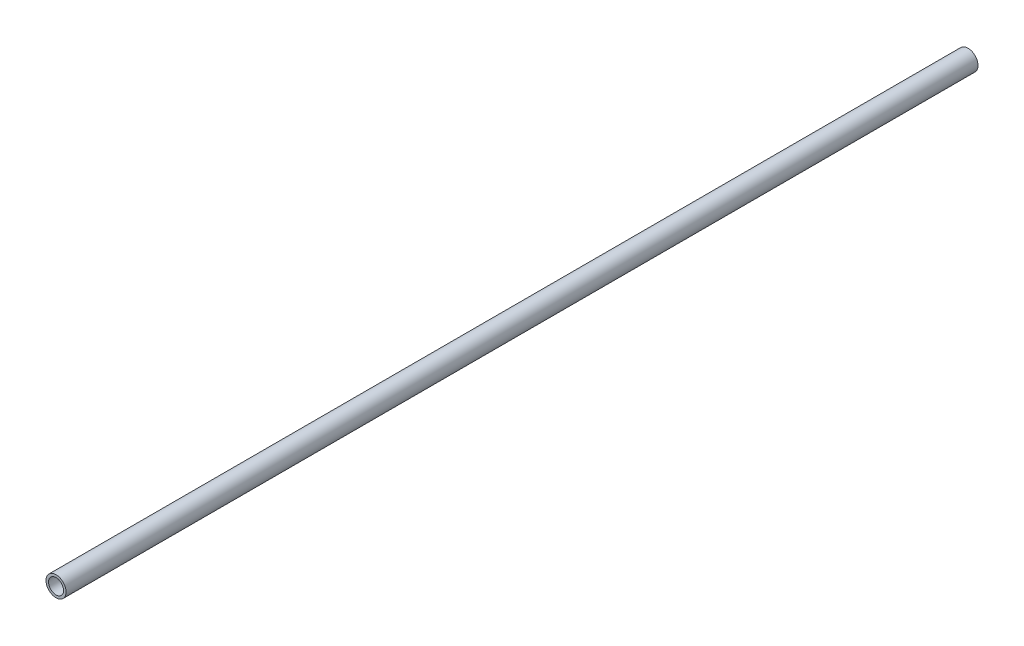
ISO-10303-21;
HEADER;
FILE_DESCRIPTION(('STEP AP214'),'2;1');
FILE_NAME('part.step','',(''),(''),'','','');
FILE_SCHEMA(('AUTOMOTIVE_DESIGN { 1 0 10303 214 1 1 1 1 }'));
ENDSEC;
DATA;
#1=APPLICATION_CONTEXT('core data for automotive mechanical design processes');
#2=APPLICATION_PROTOCOL_DEFINITION('international standard','automotive_design',2000,#1);
#3=PRODUCT_CONTEXT('',#1,'mechanical');
#4=PRODUCT('Part','Part','',(#3));
#5=PRODUCT_RELATED_PRODUCT_CATEGORY('part','',(#4));
#6=PRODUCT_DEFINITION_FORMATION('','',#4);
#7=PRODUCT_DEFINITION_CONTEXT('part definition',#1,'design');
#8=PRODUCT_DEFINITION('design','',#6,#7);
#9=PRODUCT_DEFINITION_SHAPE('','',#8);
#10=(LENGTH_UNIT() NAMED_UNIT(*) SI_UNIT(.MILLI.,.METRE.));
#11=(NAMED_UNIT(*) PLANE_ANGLE_UNIT() SI_UNIT($,.RADIAN.));
#12=(NAMED_UNIT(*) SI_UNIT($,.STERADIAN.) SOLID_ANGLE_UNIT());
#13=UNCERTAINTY_MEASURE_WITH_UNIT(LENGTH_MEASURE(1.E-05),#10,'distance_accuracy_value','');
#14=(GEOMETRIC_REPRESENTATION_CONTEXT(3) GLOBAL_UNCERTAINTY_ASSIGNED_CONTEXT((#13)) GLOBAL_UNIT_ASSIGNED_CONTEXT((#10,
#11,#12)) REPRESENTATION_CONTEXT('',''));
#15=CARTESIAN_POINT('',(0.,0.,0.));
#16=DIRECTION('',(0.,0.,1.));
#17=DIRECTION('',(1.,0.,0.));
#18=AXIS2_PLACEMENT_3D('',#15,#16,#17);
#19=CARTESIAN_POINT('',(0.,0.,865.378));
#20=DIRECTION('',(0.,0.,1.));
#21=DIRECTION('',(1.,0.,0.));
#22=AXIS2_PLACEMENT_3D('',#19,#20,#21);
#23=PLANE('',#22);
#24=CARTESIAN_POINT('',(0.,0.,865.378));
#25=DIRECTION('',(0.,0.,1.));
#26=DIRECTION('',(1.,0.,0.));
#27=AXIS2_PLACEMENT_3D('',#24,#25,#26);
#28=CIRCLE('',#27,9.525);
#29=CARTESIAN_POINT('',(9.525,0.,865.378));
#30=VERTEX_POINT('',#29);
#31=EDGE_CURVE('E10',#30,#30,#28,.T.);
#32=ORIENTED_EDGE('',*,*,#31,.T.);
#33=EDGE_LOOP('',(#32));
#34=FACE_BOUND('',#33,.T.);
#35=CARTESIAN_POINT('',(0.,0.,865.378));
#36=DIRECTION('',(0.,0.,1.));
#37=DIRECTION('',(1.,0.,0.));
#38=AXIS2_PLACEMENT_3D('',#35,#36,#37);
#39=CIRCLE('',#38,7.14375);
#40=CARTESIAN_POINT('',(7.14375,0.,865.378));
#41=VERTEX_POINT('',#40);
#42=EDGE_CURVE('E50',#41,#41,#39,.T.);
#43=ORIENTED_EDGE('',*,*,#42,.F.);
#44=EDGE_LOOP('',(#43));
#45=FACE_BOUND('',#44,.T.);
#46=ADVANCED_FACE('F39',(#34,#45),#23,.T.);
#47=CARTESIAN_POINT('',(0.,0.,0.));
#48=DIRECTION('',(0.,0.,1.));
#49=DIRECTION('',(1.,0.,0.));
#50=AXIS2_PLACEMENT_3D('',#47,#48,#49);
#51=PLANE('',#50);
#52=CARTESIAN_POINT('',(0.,0.,0.));
#53=DIRECTION('',(0.,0.,1.));
#54=DIRECTION('',(1.,0.,0.));
#55=AXIS2_PLACEMENT_3D('',#52,#53,#54);
#56=CIRCLE('',#55,9.525);
#57=CARTESIAN_POINT('',(9.525,0.,0.));
#58=VERTEX_POINT('',#57);
#59=EDGE_CURVE('E43',#58,#58,#56,.T.);
#60=ORIENTED_EDGE('',*,*,#59,.F.);
#61=EDGE_LOOP('',(#60));
#62=FACE_BOUND('',#61,.T.);
#63=CARTESIAN_POINT('',(0.,0.,0.));
#64=DIRECTION('',(0.,0.,1.));
#65=DIRECTION('',(1.,0.,0.));
#66=AXIS2_PLACEMENT_3D('',#63,#64,#65);
#67=CIRCLE('',#66,7.14375);
#68=CARTESIAN_POINT('',(7.14375,0.,0.));
#69=VERTEX_POINT('',#68);
#70=EDGE_CURVE('E52',#69,#69,#67,.T.);
#71=ORIENTED_EDGE('',*,*,#70,.T.);
#72=EDGE_LOOP('',(#71));
#73=FACE_BOUND('',#72,.T.);
#74=ADVANCED_FACE('F62',(#62,#73),#51,.F.);
#75=CARTESIAN_POINT('',(0.,0.,865.378));
#76=DIRECTION('',(0.,0.,-1.));
#77=DIRECTION('',(-1.,0.,0.));
#78=AXIS2_PLACEMENT_3D('',#75,#76,#77);
#79=CYLINDRICAL_SURFACE('',#78,9.525);
#80=ORIENTED_EDGE('',*,*,#31,.F.);
#81=EDGE_LOOP('',(#80));
#82=FACE_BOUND('',#81,.T.);
#83=ORIENTED_EDGE('',*,*,#59,.T.);
#84=EDGE_LOOP('',(#83));
#85=FACE_BOUND('',#84,.T.);
#86=ADVANCED_FACE('F41',(#82,#85),#79,.T.);
#87=CARTESIAN_POINT('',(0.,0.,865.378));
#88=DIRECTION('',(0.,0.,-1.));
#89=DIRECTION('',(-1.,0.,0.));
#90=AXIS2_PLACEMENT_3D('',#87,#88,#89);
#91=CYLINDRICAL_SURFACE('',#90,7.14375);
#92=ORIENTED_EDGE('',*,*,#42,.T.);
#93=EDGE_LOOP('',(#92));
#94=FACE_BOUND('',#93,.T.);
#95=ORIENTED_EDGE('',*,*,#70,.F.);
#96=EDGE_LOOP('',(#95));
#97=FACE_BOUND('',#96,.T.);
#98=ADVANCED_FACE('F58',(#94,#97),#91,.F.);
#99=CLOSED_SHELL('',(#46,#74,#86,#98));
#100=MANIFOLD_SOLID_BREP('B2',#99);
#101=ADVANCED_BREP_SHAPE_REPRESENTATION('',(#18,#100),#14);
#102=SHAPE_DEFINITION_REPRESENTATION(#9,#101);
ENDSEC;
END-ISO-10303-21;
